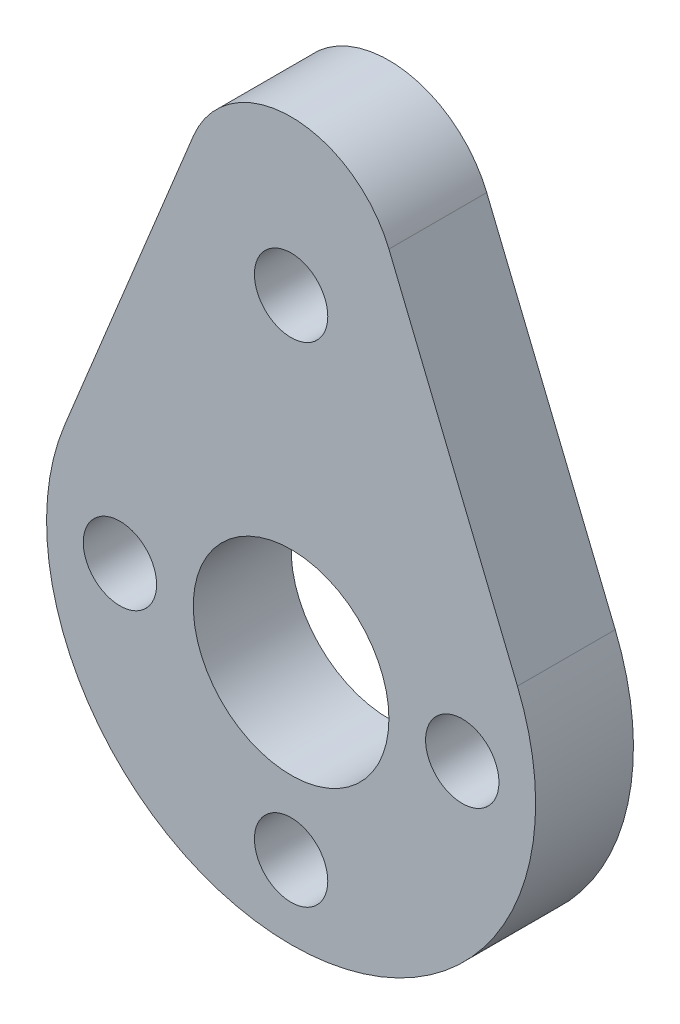
ISO-10303-21;
HEADER;
FILE_DESCRIPTION(('STEP AP214'),'2;1');
FILE_NAME('part.step','',(''),(''),'','','');
FILE_SCHEMA(('AUTOMOTIVE_DESIGN { 1 0 10303 214 1 1 1 1 }'));
ENDSEC;
DATA;
#1=APPLICATION_CONTEXT('core data for automotive mechanical design processes');
#2=APPLICATION_PROTOCOL_DEFINITION('international standard','automotive_design',2000,#1);
#3=PRODUCT_CONTEXT('',#1,'mechanical');
#4=PRODUCT('Part','Part','',(#3));
#5=PRODUCT_RELATED_PRODUCT_CATEGORY('part','',(#4));
#6=PRODUCT_DEFINITION_FORMATION('','',#4);
#7=PRODUCT_DEFINITION_CONTEXT('part definition',#1,'design');
#8=PRODUCT_DEFINITION('design','',#6,#7);
#9=PRODUCT_DEFINITION_SHAPE('','',#8);
#10=(LENGTH_UNIT() NAMED_UNIT(*) SI_UNIT(.MILLI.,.METRE.));
#11=(NAMED_UNIT(*) PLANE_ANGLE_UNIT() SI_UNIT($,.RADIAN.));
#12=(NAMED_UNIT(*) SI_UNIT($,.STERADIAN.) SOLID_ANGLE_UNIT());
#13=UNCERTAINTY_MEASURE_WITH_UNIT(LENGTH_MEASURE(1.E-05),#10,'distance_accuracy_value','');
#14=(GEOMETRIC_REPRESENTATION_CONTEXT(3) GLOBAL_UNCERTAINTY_ASSIGNED_CONTEXT((#13)) GLOBAL_UNIT_ASSIGNED_CONTEXT((#10,
#11,#12)) REPRESENTATION_CONTEXT('',''));
#15=CARTESIAN_POINT('',(0.,0.,0.));
#16=DIRECTION('',(0.,0.,1.));
#17=DIRECTION('',(1.,0.,0.));
#18=AXIS2_PLACEMENT_3D('',#15,#16,#17);
#19=CARTESIAN_POINT('',(0.,0.,4.));
#20=DIRECTION('',(0.,0.,1.));
#21=DIRECTION('',(1.,0.,0.));
#22=AXIS2_PLACEMENT_3D('',#19,#20,#21);
#23=PLANE('',#22);
#24=CARTESIAN_POINT('',(0.,13.,4.));
#25=DIRECTION('',(0.,0.,1.));
#26=DIRECTION('',(1.,0.,0.));
#27=AXIS2_PLACEMENT_3D('',#24,#25,#26);
#28=CIRCLE('',#27,1.5);
#29=CARTESIAN_POINT('',(1.5,13.,4.));
#30=VERTEX_POINT('',#29);
#31=EDGE_CURVE('E128',#30,#30,#28,.T.);
#32=ORIENTED_EDGE('',*,*,#31,.F.);
#33=EDGE_LOOP('',(#32));
#34=FACE_BOUND('',#33,.T.);
#35=CARTESIAN_POINT('',(7.,0.,4.));
#36=DIRECTION('',(0.,0.,1.));
#37=DIRECTION('',(1.,0.,0.));
#38=AXIS2_PLACEMENT_3D('',#35,#36,#37);
#39=CIRCLE('',#38,1.5);
#40=CARTESIAN_POINT('',(8.5,0.,4.));
#41=VERTEX_POINT('',#40);
#42=EDGE_CURVE('E116',#41,#41,#39,.T.);
#43=ORIENTED_EDGE('',*,*,#42,.F.);
#44=EDGE_LOOP('',(#43));
#45=FACE_BOUND('',#44,.T.);
#46=CARTESIAN_POINT('',(0.,0.,4.));
#47=DIRECTION('',(0.,0.,1.));
#48=DIRECTION('',(1.,0.,0.));
#49=AXIS2_PLACEMENT_3D('',#46,#47,#48);
#50=CIRCLE('',#49,10.);
#51=CARTESIAN_POINT('',(-9.25577472080902,3.78558242779532,4.));
#52=VERTEX_POINT('',#51);
#53=CARTESIAN_POINT('',(9.25577472080902,3.78558242779532,4.));
#54=VERTEX_POINT('',#53);
#55=EDGE_CURVE('E86',#52,#54,#50,.T.);
#56=ORIENTED_EDGE('',*,*,#55,.T.);
#57=DIRECTION('',(-0.378558242779533,0.925577472080902,0.));
#58=VECTOR('',#57,1.);
#59=CARTESIAN_POINT('',(4.,16.6359872801504,4.));
#60=LINE('',#59,#58);
#61=CARTESIAN_POINT('',(4.,16.6359872801504,4.));
#62=VERTEX_POINT('',#61);
#63=EDGE_CURVE('E81',#54,#62,#60,.T.);
#64=ORIENTED_EDGE('',*,*,#63,.T.);
#65=CARTESIAN_POINT('',(0.,15.,4.));
#66=DIRECTION('',(0.,0.,1.));
#67=DIRECTION('',(-1.,0.,0.));
#68=AXIS2_PLACEMENT_3D('',#65,#66,#67);
#69=CIRCLE('',#68,4.32162635830701);
#70=CARTESIAN_POINT('',(-4.,16.6359872801504,4.));
#71=VERTEX_POINT('',#70);
#72=EDGE_CURVE('E84',#62,#71,#69,.T.);
#73=ORIENTED_EDGE('',*,*,#72,.T.);
#74=DIRECTION('',(-0.378558242779533,-0.925577472080902,0.));
#75=VECTOR('',#74,1.);
#76=CARTESIAN_POINT('',(-4.,16.6359872801504,4.));
#77=LINE('',#76,#75);
#78=EDGE_CURVE('E51',#71,#52,#77,.T.);
#79=ORIENTED_EDGE('',*,*,#78,.T.);
#80=EDGE_LOOP('',(#56,#64,#73,#79));
#81=FACE_BOUND('',#80,.T.);
#82=CARTESIAN_POINT('',(-7.,0.,4.));
#83=DIRECTION('',(0.,0.,1.));
#84=DIRECTION('',(1.,0.,0.));
#85=AXIS2_PLACEMENT_3D('',#82,#83,#84);
#86=CIRCLE('',#85,1.5);
#87=CARTESIAN_POINT('',(-5.5,0.,4.));
#88=VERTEX_POINT('',#87);
#89=EDGE_CURVE('E101',#88,#88,#86,.T.);
#90=ORIENTED_EDGE('',*,*,#89,.F.);
#91=EDGE_LOOP('',(#90));
#92=FACE_BOUND('',#91,.T.);
#93=CARTESIAN_POINT('',(0.,-7.,4.));
#94=DIRECTION('',(0.,0.,1.));
#95=DIRECTION('',(1.,0.,0.));
#96=AXIS2_PLACEMENT_3D('',#93,#94,#95);
#97=CIRCLE('',#96,1.5);
#98=CARTESIAN_POINT('',(1.5,-7.,4.));
#99=VERTEX_POINT('',#98);
#100=EDGE_CURVE('E122',#99,#99,#97,.T.);
#101=ORIENTED_EDGE('',*,*,#100,.F.);
#102=EDGE_LOOP('',(#101));
#103=FACE_BOUND('',#102,.T.);
#104=CARTESIAN_POINT('',(0.,0.,4.));
#105=DIRECTION('',(0.,0.,1.));
#106=DIRECTION('',(1.,0.,0.));
#107=AXIS2_PLACEMENT_3D('',#104,#105,#106);
#108=CIRCLE('',#107,4.);
#109=CARTESIAN_POINT('',(4.,0.,4.));
#110=VERTEX_POINT('',#109);
#111=EDGE_CURVE('E134',#110,#110,#108,.T.);
#112=ORIENTED_EDGE('',*,*,#111,.F.);
#113=EDGE_LOOP('',(#112));
#114=FACE_BOUND('',#113,.T.);
#115=ADVANCED_FACE('F34',(#34,#45,#81,#92,#103,#114),#23,.T.);
#116=CARTESIAN_POINT('',(0.,0.,0.));
#117=DIRECTION('',(0.,0.,1.));
#118=DIRECTION('',(1.,0.,0.));
#119=AXIS2_PLACEMENT_3D('',#116,#117,#118);
#120=PLANE('',#119);
#121=CARTESIAN_POINT('',(0.,13.,0.));
#122=DIRECTION('',(0.,0.,1.));
#123=DIRECTION('',(1.,0.,0.));
#124=AXIS2_PLACEMENT_3D('',#121,#122,#123);
#125=CIRCLE('',#124,1.5);
#126=CARTESIAN_POINT('',(1.5,13.,0.));
#127=VERTEX_POINT('',#126);
#128=EDGE_CURVE('E131',#127,#127,#125,.T.);
#129=ORIENTED_EDGE('',*,*,#128,.T.);
#130=EDGE_LOOP('',(#129));
#131=FACE_BOUND('',#130,.T.);
#132=CARTESIAN_POINT('',(7.,0.,0.));
#133=DIRECTION('',(0.,0.,1.));
#134=DIRECTION('',(1.,0.,0.));
#135=AXIS2_PLACEMENT_3D('',#132,#133,#134);
#136=CIRCLE('',#135,1.5);
#137=CARTESIAN_POINT('',(8.5,0.,0.));
#138=VERTEX_POINT('',#137);
#139=EDGE_CURVE('E119',#138,#138,#136,.T.);
#140=ORIENTED_EDGE('',*,*,#139,.T.);
#141=EDGE_LOOP('',(#140));
#142=FACE_BOUND('',#141,.T.);
#143=CARTESIAN_POINT('',(0.,0.,0.));
#144=DIRECTION('',(0.,0.,1.));
#145=DIRECTION('',(1.,0.,0.));
#146=AXIS2_PLACEMENT_3D('',#143,#144,#145);
#147=CIRCLE('',#146,10.);
#148=CARTESIAN_POINT('',(-9.25577472080902,3.78558242779532,0.));
#149=VERTEX_POINT('',#148);
#150=CARTESIAN_POINT('',(9.25577472080902,3.78558242779532,0.));
#151=VERTEX_POINT('',#150);
#152=EDGE_CURVE('E98',#149,#151,#147,.T.);
#153=ORIENTED_EDGE('',*,*,#152,.F.);
#154=DIRECTION('',(-0.378558242779533,-0.925577472080902,0.));
#155=VECTOR('',#154,1.);
#156=CARTESIAN_POINT('',(-4.,16.6359872801504,0.));
#157=LINE('',#156,#155);
#158=CARTESIAN_POINT('',(-4.,16.6359872801504,0.));
#159=VERTEX_POINT('',#158);
#160=EDGE_CURVE('E74',#159,#149,#157,.T.);
#161=ORIENTED_EDGE('',*,*,#160,.F.);
#162=CARTESIAN_POINT('',(0.,15.,0.));
#163=DIRECTION('',(0.,0.,1.));
#164=DIRECTION('',(-1.,0.,0.));
#165=AXIS2_PLACEMENT_3D('',#162,#163,#164);
#166=CIRCLE('',#165,4.32162635830701);
#167=CARTESIAN_POINT('',(4.,16.6359872801504,0.));
#168=VERTEX_POINT('',#167);
#169=EDGE_CURVE('E68',#168,#159,#166,.T.);
#170=ORIENTED_EDGE('',*,*,#169,.F.);
#171=DIRECTION('',(-0.378558242779533,0.925577472080902,0.));
#172=VECTOR('',#171,1.);
#173=CARTESIAN_POINT('',(4.,16.6359872801504,0.));
#174=LINE('',#173,#172);
#175=EDGE_CURVE('E90',#151,#168,#174,.T.);
#176=ORIENTED_EDGE('',*,*,#175,.F.);
#177=EDGE_LOOP('',(#153,#161,#170,#176));
#178=FACE_BOUND('',#177,.T.);
#179=CARTESIAN_POINT('',(-7.,0.,0.));
#180=DIRECTION('',(0.,0.,1.));
#181=DIRECTION('',(1.,0.,0.));
#182=AXIS2_PLACEMENT_3D('',#179,#180,#181);
#183=CIRCLE('',#182,1.5);
#184=CARTESIAN_POINT('',(-5.5,0.,0.));
#185=VERTEX_POINT('',#184);
#186=EDGE_CURVE('E113',#185,#185,#183,.T.);
#187=ORIENTED_EDGE('',*,*,#186,.T.);
#188=EDGE_LOOP('',(#187));
#189=FACE_BOUND('',#188,.T.);
#190=CARTESIAN_POINT('',(0.,-7.,0.));
#191=DIRECTION('',(0.,0.,1.));
#192=DIRECTION('',(1.,0.,0.));
#193=AXIS2_PLACEMENT_3D('',#190,#191,#192);
#194=CIRCLE('',#193,1.5);
#195=CARTESIAN_POINT('',(1.5,-7.,0.));
#196=VERTEX_POINT('',#195);
#197=EDGE_CURVE('E125',#196,#196,#194,.T.);
#198=ORIENTED_EDGE('',*,*,#197,.T.);
#199=EDGE_LOOP('',(#198));
#200=FACE_BOUND('',#199,.T.);
#201=CARTESIAN_POINT('',(0.,0.,0.));
#202=DIRECTION('',(0.,0.,1.));
#203=DIRECTION('',(1.,0.,0.));
#204=AXIS2_PLACEMENT_3D('',#201,#202,#203);
#205=CIRCLE('',#204,4.);
#206=CARTESIAN_POINT('',(4.,0.,0.));
#207=VERTEX_POINT('',#206);
#208=EDGE_CURVE('E137',#207,#207,#205,.T.);
#209=ORIENTED_EDGE('',*,*,#208,.T.);
#210=EDGE_LOOP('',(#209));
#211=FACE_BOUND('',#210,.T.);
#212=ADVANCED_FACE('F109',(#131,#142,#178,#189,#200,#211),#120,.F.);
#213=CARTESIAN_POINT('',(0.,0.,4.));
#214=DIRECTION('',(0.,0.,-1.));
#215=DIRECTION('',(-1.,0.,0.));
#216=AXIS2_PLACEMENT_3D('',#213,#214,#215);
#217=CYLINDRICAL_SURFACE('',#216,10.);
#218=ORIENTED_EDGE('',*,*,#152,.T.);
#219=DIRECTION('',(0.,0.,-1.));
#220=VECTOR('',#219,1.);
#221=CARTESIAN_POINT('',(9.25577472080902,3.78558242779532,4.));
#222=LINE('',#221,#220);
#223=EDGE_CURVE('E11',#54,#151,#222,.T.);
#224=ORIENTED_EDGE('',*,*,#223,.F.);
#225=ORIENTED_EDGE('',*,*,#55,.F.);
#226=DIRECTION('',(0.,0.,-1.));
#227=VECTOR('',#226,1.);
#228=CARTESIAN_POINT('',(-9.25577472080902,3.78558242779532,4.));
#229=LINE('',#228,#227);
#230=EDGE_CURVE('E94',#52,#149,#229,.T.);
#231=ORIENTED_EDGE('',*,*,#230,.T.);
#232=EDGE_LOOP('',(#218,#224,#225,#231));
#233=FACE_BOUND('',#232,.T.);
#234=ADVANCED_FACE('F36',(#233),#217,.T.);
#235=CARTESIAN_POINT('',(4.,16.6359872801504,4.));
#236=DIRECTION('',(-0.925577472080902,-0.378558242779533,0.));
#237=DIRECTION('',(0.378558242779533,-0.925577472080902,0.));
#238=AXIS2_PLACEMENT_3D('',#235,#236,#237);
#239=PLANE('',#238);
#240=ORIENTED_EDGE('',*,*,#175,.T.);
#241=DIRECTION('',(0.,0.,-1.));
#242=VECTOR('',#241,1.);
#243=CARTESIAN_POINT('',(4.,16.6359872801504,4.));
#244=LINE('',#243,#242);
#245=EDGE_CURVE('E43',#62,#168,#244,.T.);
#246=ORIENTED_EDGE('',*,*,#245,.F.);
#247=ORIENTED_EDGE('',*,*,#63,.F.);
#248=ORIENTED_EDGE('',*,*,#223,.T.);
#249=EDGE_LOOP('',(#240,#246,#247,#248));
#250=FACE_BOUND('',#249,.T.);
#251=ADVANCED_FACE('F89',(#250),#239,.F.);
#252=CARTESIAN_POINT('',(0.,15.,4.));
#253=DIRECTION('',(0.,0.,-1.));
#254=DIRECTION('',(-1.,0.,0.));
#255=AXIS2_PLACEMENT_3D('',#252,#253,#254);
#256=CYLINDRICAL_SURFACE('',#255,4.32162635830701);
#257=ORIENTED_EDGE('',*,*,#169,.T.);
#258=DIRECTION('',(0.,0.,-1.));
#259=VECTOR('',#258,1.);
#260=CARTESIAN_POINT('',(-4.,16.6359872801504,4.));
#261=LINE('',#260,#259);
#262=EDGE_CURVE('E91',#71,#159,#261,.T.);
#263=ORIENTED_EDGE('',*,*,#262,.F.);
#264=ORIENTED_EDGE('',*,*,#72,.F.);
#265=ORIENTED_EDGE('',*,*,#245,.T.);
#266=EDGE_LOOP('',(#257,#263,#264,#265));
#267=FACE_BOUND('',#266,.T.);
#268=ADVANCED_FACE('F92',(#267),#256,.T.);
#269=CARTESIAN_POINT('',(-4.,16.6359872801504,4.));
#270=DIRECTION('',(0.925577472080902,-0.378558242779533,0.));
#271=DIRECTION('',(0.378558242779533,0.925577472080902,0.));
#272=AXIS2_PLACEMENT_3D('',#269,#270,#271);
#273=PLANE('',#272);
#274=ORIENTED_EDGE('',*,*,#160,.T.);
#275=ORIENTED_EDGE('',*,*,#230,.F.);
#276=ORIENTED_EDGE('',*,*,#78,.F.);
#277=ORIENTED_EDGE('',*,*,#262,.T.);
#278=EDGE_LOOP('',(#274,#275,#276,#277));
#279=FACE_BOUND('',#278,.T.);
#280=ADVANCED_FACE('F106',(#279),#273,.F.);
#281=CARTESIAN_POINT('',(-7.,0.,4.));
#282=DIRECTION('',(0.,0.,-1.));
#283=DIRECTION('',(-1.,0.,0.));
#284=AXIS2_PLACEMENT_3D('',#281,#282,#283);
#285=CYLINDRICAL_SURFACE('',#284,1.5);
#286=ORIENTED_EDGE('',*,*,#89,.T.);
#287=EDGE_LOOP('',(#286));
#288=FACE_BOUND('',#287,.T.);
#289=ORIENTED_EDGE('',*,*,#186,.F.);
#290=EDGE_LOOP('',(#289));
#291=FACE_BOUND('',#290,.T.);
#292=ADVANCED_FACE('F157',(#288,#291),#285,.F.);
#293=CARTESIAN_POINT('',(7.,0.,4.));
#294=DIRECTION('',(0.,0.,-1.));
#295=DIRECTION('',(-1.,0.,0.));
#296=AXIS2_PLACEMENT_3D('',#293,#294,#295);
#297=CYLINDRICAL_SURFACE('',#296,1.5);
#298=ORIENTED_EDGE('',*,*,#42,.T.);
#299=EDGE_LOOP('',(#298));
#300=FACE_BOUND('',#299,.T.);
#301=ORIENTED_EDGE('',*,*,#139,.F.);
#302=EDGE_LOOP('',(#301));
#303=FACE_BOUND('',#302,.T.);
#304=ADVANCED_FACE('F203',(#300,#303),#297,.F.);
#305=CARTESIAN_POINT('',(0.,-7.,4.));
#306=DIRECTION('',(0.,0.,-1.));
#307=DIRECTION('',(-1.,0.,0.));
#308=AXIS2_PLACEMENT_3D('',#305,#306,#307);
#309=CYLINDRICAL_SURFACE('',#308,1.5);
#310=ORIENTED_EDGE('',*,*,#100,.T.);
#311=EDGE_LOOP('',(#310));
#312=FACE_BOUND('',#311,.T.);
#313=ORIENTED_EDGE('',*,*,#197,.F.);
#314=EDGE_LOOP('',(#313));
#315=FACE_BOUND('',#314,.T.);
#316=ADVANCED_FACE('F211',(#312,#315),#309,.F.);
#317=CARTESIAN_POINT('',(0.,13.,4.));
#318=DIRECTION('',(0.,0.,-1.));
#319=DIRECTION('',(-1.,0.,0.));
#320=AXIS2_PLACEMENT_3D('',#317,#318,#319);
#321=CYLINDRICAL_SURFACE('',#320,1.5);
#322=ORIENTED_EDGE('',*,*,#31,.T.);
#323=EDGE_LOOP('',(#322));
#324=FACE_BOUND('',#323,.T.);
#325=ORIENTED_EDGE('',*,*,#128,.F.);
#326=EDGE_LOOP('',(#325));
#327=FACE_BOUND('',#326,.T.);
#328=ADVANCED_FACE('F219',(#324,#327),#321,.F.);
#329=CARTESIAN_POINT('',(0.,0.,4.));
#330=DIRECTION('',(0.,0.,-1.));
#331=DIRECTION('',(-1.,0.,0.));
#332=AXIS2_PLACEMENT_3D('',#329,#330,#331);
#333=CYLINDRICAL_SURFACE('',#332,4.);
#334=ORIENTED_EDGE('',*,*,#111,.T.);
#335=EDGE_LOOP('',(#334));
#336=FACE_BOUND('',#335,.T.);
#337=ORIENTED_EDGE('',*,*,#208,.F.);
#338=EDGE_LOOP('',(#337));
#339=FACE_BOUND('',#338,.T.);
#340=ADVANCED_FACE('F143',(#336,#339),#333,.F.);
#341=CLOSED_SHELL('',(#115,#212,#234,#251,#268,#280,#292,#304,#316,#328,#340));
#342=MANIFOLD_SOLID_BREP('B2',#341);
#343=ADVANCED_BREP_SHAPE_REPRESENTATION('',(#18,#342),#14);
#344=SHAPE_DEFINITION_REPRESENTATION(#9,#343);
ENDSEC;
END-ISO-10303-21;
